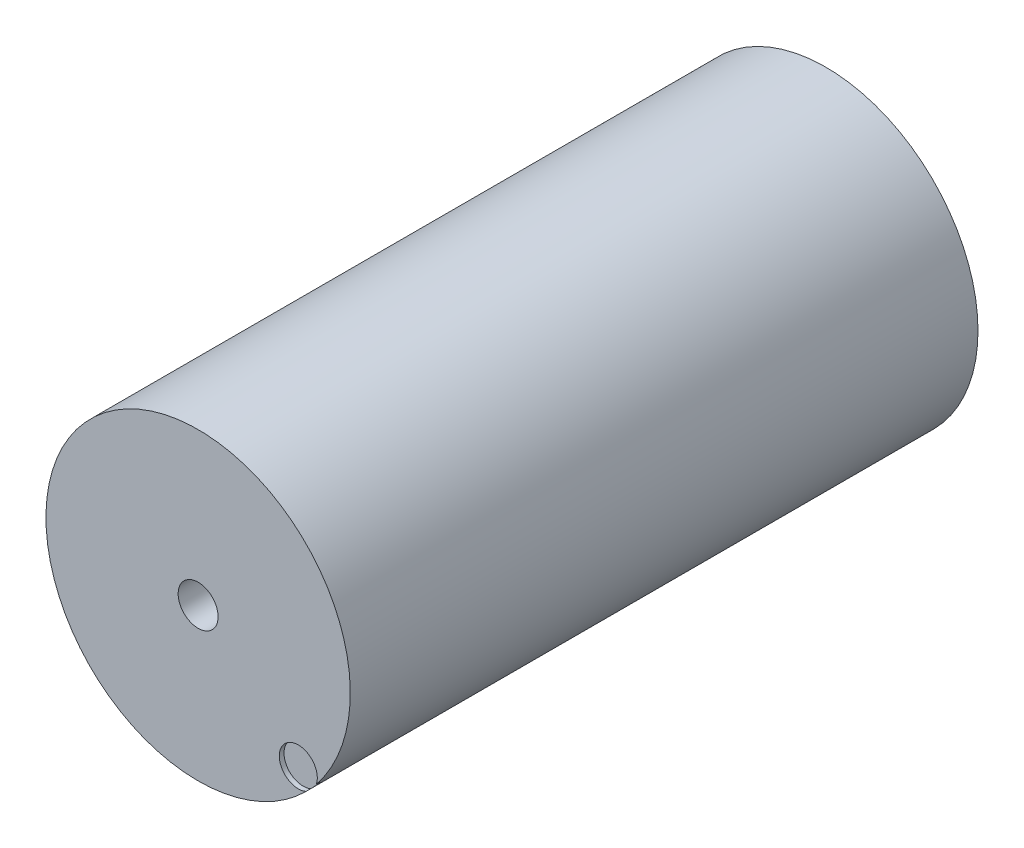
ISO-10303-21;
HEADER;
FILE_DESCRIPTION(('STEP AP214'),'2;1');
FILE_NAME('part.step','',(''),(''),'','','');
FILE_SCHEMA(('AUTOMOTIVE_DESIGN { 1 0 10303 214 1 1 1 1 }'));
ENDSEC;
DATA;
#1=APPLICATION_CONTEXT('core data for automotive mechanical design processes');
#2=APPLICATION_PROTOCOL_DEFINITION('international standard','automotive_design',2000,#1);
#3=PRODUCT_CONTEXT('',#1,'mechanical');
#4=PRODUCT('Part','Part','',(#3));
#5=PRODUCT_RELATED_PRODUCT_CATEGORY('part','',(#4));
#6=PRODUCT_DEFINITION_FORMATION('','',#4);
#7=PRODUCT_DEFINITION_CONTEXT('part definition',#1,'design');
#8=PRODUCT_DEFINITION('design','',#6,#7);
#9=PRODUCT_DEFINITION_SHAPE('','',#8);
#10=(LENGTH_UNIT() NAMED_UNIT(*) SI_UNIT(.MILLI.,.METRE.));
#11=(NAMED_UNIT(*) PLANE_ANGLE_UNIT() SI_UNIT($,.RADIAN.));
#12=(NAMED_UNIT(*) SI_UNIT($,.STERADIAN.) SOLID_ANGLE_UNIT());
#13=UNCERTAINTY_MEASURE_WITH_UNIT(LENGTH_MEASURE(1.E-05),#10,'distance_accuracy_value','');
#14=(GEOMETRIC_REPRESENTATION_CONTEXT(3) GLOBAL_UNCERTAINTY_ASSIGNED_CONTEXT((#13)) GLOBAL_UNIT_ASSIGNED_CONTEXT((#10,
#11,#12)) REPRESENTATION_CONTEXT('',''));
#15=CARTESIAN_POINT('',(0.,0.,0.));
#16=DIRECTION('',(0.,0.,1.));
#17=DIRECTION('',(1.,0.,0.));
#18=AXIS2_PLACEMENT_3D('',#15,#16,#17);
#19=CARTESIAN_POINT('',(0.,0.,0.));
#20=DIRECTION('',(0.,0.,1.));
#21=DIRECTION('',(1.,0.,0.));
#22=AXIS2_PLACEMENT_3D('',#19,#20,#21);
#23=PLANE('',#22);
#24=CARTESIAN_POINT('',(0.,0.,0.));
#25=DIRECTION('',(0.,0.,1.));
#26=DIRECTION('',(1.,0.,0.));
#27=AXIS2_PLACEMENT_3D('',#24,#25,#26);
#28=CIRCLE('',#27,2.09999999999998);
#29=CARTESIAN_POINT('',(2.09999999999998,0.,0.));
#30=VERTEX_POINT('',#29);
#31=EDGE_CURVE('E89',#30,#30,#28,.T.);
#32=ORIENTED_EDGE('',*,*,#31,.T.);
#33=EDGE_LOOP('',(#32));
#34=FACE_BOUND('',#33,.T.);
#35=CARTESIAN_POINT('',(0.,0.,0.));
#36=DIRECTION('',(0.,0.,1.));
#37=DIRECTION('',(1.,0.,0.));
#38=AXIS2_PLACEMENT_3D('',#35,#36,#37);
#39=CIRCLE('',#38,16.);
#40=CARTESIAN_POINT('',(16.,0.,0.));
#41=VERTEX_POINT('',#40);
#42=EDGE_CURVE('E98',#41,#41,#39,.T.);
#43=ORIENTED_EDGE('',*,*,#42,.F.);
#44=EDGE_LOOP('',(#43));
#45=FACE_BOUND('',#44,.T.);
#46=ADVANCED_FACE('F60',(#34,#45),#23,.F.);
#47=CARTESIAN_POINT('',(0.,0.,66.));
#48=DIRECTION('',(0.,0.,1.));
#49=DIRECTION('',(1.,0.,0.));
#50=AXIS2_PLACEMENT_3D('',#47,#48,#49);
#51=PLANE('',#50);
#52=CARTESIAN_POINT('',(0.,0.,66.));
#53=DIRECTION('',(0.,0.,1.));
#54=DIRECTION('',(1.,0.,0.));
#55=AXIS2_PLACEMENT_3D('',#52,#53,#54);
#56=CIRCLE('',#55,2.09999999999999);
#57=CARTESIAN_POINT('',(2.09999999999999,0.,66.));
#58=VERTEX_POINT('',#57);
#59=EDGE_CURVE('E213',#58,#58,#56,.T.);
#60=ORIENTED_EDGE('',*,*,#59,.F.);
#61=EDGE_LOOP('',(#60));
#62=FACE_BOUND('',#61,.T.);
#63=CARTESIAN_POINT('',(10.5321145046291,-9.45328245563246,66.));
#64=DIRECTION('',(0.,0.,1.));
#65=DIRECTION('',(1.,0.,0.));
#66=AXIS2_PLACEMENT_3D('',#63,#64,#65);
#67=CIRCLE('',#66,1.99999999999999);
#68=CARTESIAN_POINT('',(12.435338152409,-10.0678878139976,66.));
#69=VERTEX_POINT('',#68);
#70=CARTESIAN_POINT('',(11.3480272997679,-11.2792852789404,66.));
#71=VERTEX_POINT('',#70);
#72=EDGE_CURVE('E82',#69,#71,#67,.T.);
#73=ORIENTED_EDGE('',*,*,#72,.F.);
#74=CARTESIAN_POINT('',(0.,0.,66.));
#75=DIRECTION('',(0.,0.,1.));
#76=DIRECTION('',(1.,0.,0.));
#77=AXIS2_PLACEMENT_3D('',#74,#75,#76);
#78=CIRCLE('',#77,16.);
#79=EDGE_CURVE('E95',#69,#71,#78,.T.);
#80=ORIENTED_EDGE('',*,*,#79,.T.);
#81=EDGE_LOOP('',(#73,#80));
#82=FACE_BOUND('',#81,.T.);
#83=ADVANCED_FACE('F96',(#62,#82),#51,.T.);
#84=CARTESIAN_POINT('',(0.,0.,66.));
#85=DIRECTION('',(0.,0.,-1.));
#86=DIRECTION('',(-1.,0.,0.));
#87=AXIS2_PLACEMENT_3D('',#84,#85,#86);
#88=CYLINDRICAL_SURFACE('',#87,16.);
#89=DIRECTION('',(0.,0.,1.));
#90=VECTOR('',#89,1.);
#91=CARTESIAN_POINT('',(11.348027299768,-11.2792852789404,65.75));
#92=LINE('',#91,#90);
#93=CARTESIAN_POINT('',(11.348027299768,-11.2792852789404,65.5));
#94=VERTEX_POINT('',#93);
#95=EDGE_CURVE('E12',#71,#94,#92,.F.);
#96=ORIENTED_EDGE('',*,*,#95,.F.);
#97=ORIENTED_EDGE('',*,*,#79,.F.);
#98=DIRECTION('',(0.,0.,1.));
#99=VECTOR('',#98,1.);
#100=CARTESIAN_POINT('',(12.435338152409,-10.0678878139976,65.75));
#101=LINE('',#100,#99);
#102=CARTESIAN_POINT('',(12.435338152409,-10.0678878139976,65.5));
#103=VERTEX_POINT('',#102);
#104=EDGE_CURVE('E85',#103,#69,#101,.T.);
#105=ORIENTED_EDGE('',*,*,#104,.F.);
#106=CARTESIAN_POINT('',(0.,0.,65.5));
#107=DIRECTION('',(0.,0.,-1.));
#108=DIRECTION('',(-1.,0.,0.));
#109=AXIS2_PLACEMENT_3D('',#106,#107,#108);
#110=CIRCLE('',#109,16.);
#111=EDGE_CURVE('E67',#94,#103,#110,.F.);
#112=ORIENTED_EDGE('',*,*,#111,.F.);
#113=EDGE_LOOP('',(#96,#97,#105,#112));
#114=FACE_BOUND('',#113,.T.);
#115=ORIENTED_EDGE('',*,*,#42,.T.);
#116=EDGE_LOOP('',(#115));
#117=FACE_BOUND('',#116,.T.);
#118=ADVANCED_FACE('F93',(#114,#117),#88,.T.);
#119=CARTESIAN_POINT('',(10.5321145046291,-9.45328245563246,65.5));
#120=DIRECTION('',(0.,0.,-1.));
#121=DIRECTION('',(-1.,0.,0.));
#122=AXIS2_PLACEMENT_3D('',#119,#120,#121);
#123=PLANE('',#122);
#124=ORIENTED_EDGE('',*,*,#111,.T.);
#125=CARTESIAN_POINT('',(10.5321145046291,-9.45328245563246,65.5));
#126=DIRECTION('',(0.,0.,1.));
#127=DIRECTION('',(1.,0.,0.));
#128=AXIS2_PLACEMENT_3D('',#125,#126,#127);
#129=CIRCLE('',#128,1.99999999999999);
#130=EDGE_CURVE('E73',#103,#94,#129,.T.);
#131=ORIENTED_EDGE('',*,*,#130,.T.);
#132=EDGE_LOOP('',(#124,#131));
#133=FACE_BOUND('',#132,.T.);
#134=ADVANCED_FACE('F192',(#133),#123,.F.);
#135=CARTESIAN_POINT('',(10.5321145046291,-9.45328245563246,66.));
#136=DIRECTION('',(0.,0.,1.));
#137=DIRECTION('',(1.,0.,0.));
#138=AXIS2_PLACEMENT_3D('',#135,#136,#137);
#139=CYLINDRICAL_SURFACE('',#138,1.99999999999999);
#140=ORIENTED_EDGE('',*,*,#95,.T.);
#141=ORIENTED_EDGE('',*,*,#130,.F.);
#142=ORIENTED_EDGE('',*,*,#104,.T.);
#143=ORIENTED_EDGE('',*,*,#72,.T.);
#144=EDGE_LOOP('',(#140,#141,#142,#143));
#145=FACE_BOUND('',#144,.T.);
#146=ADVANCED_FACE('F83',(#145),#139,.F.);
#147=CARTESIAN_POINT('',(0.,0.,66.));
#148=DIRECTION('',(0.,0.,1.));
#149=DIRECTION('',(1.,0.,0.));
#150=AXIS2_PLACEMENT_3D('',#147,#148,#149);
#151=CYLINDRICAL_SURFACE('',#150,2.09999999999999);
#152=ORIENTED_EDGE('',*,*,#31,.F.);
#153=EDGE_LOOP('',(#152));
#154=FACE_BOUND('',#153,.T.);
#155=ORIENTED_EDGE('',*,*,#59,.T.);
#156=EDGE_LOOP('',(#155));
#157=FACE_BOUND('',#156,.T.);
#158=ADVANCED_FACE('F199',(#154,#157),#151,.F.);
#159=CLOSED_SHELL('',(#46,#83,#118,#134,#146,#158));
#160=MANIFOLD_SOLID_BREP('B2',#159);
#161=ADVANCED_BREP_SHAPE_REPRESENTATION('',(#18,#160),#14);
#162=SHAPE_DEFINITION_REPRESENTATION(#9,#161);
ENDSEC;
END-ISO-10303-21;
